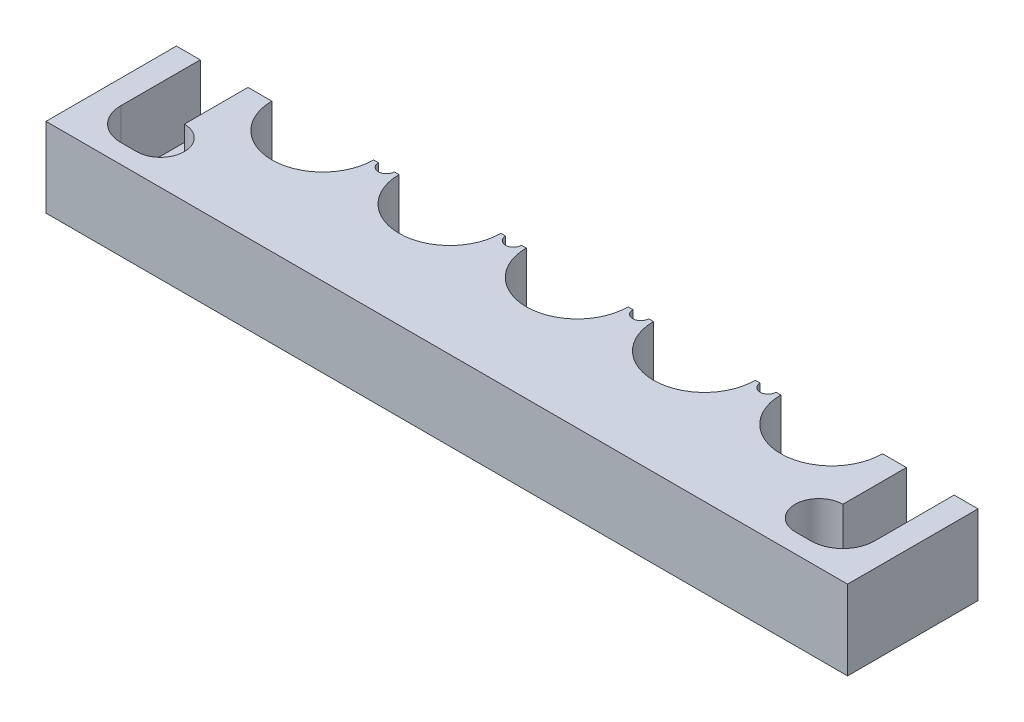
ISO-10303-21;
HEADER;
FILE_DESCRIPTION(('STEP AP214'),'2;1');
FILE_NAME('part.step','',(''),(''),'','','');
FILE_SCHEMA(('AUTOMOTIVE_DESIGN { 1 0 10303 214 1 1 1 1 }'));
ENDSEC;
DATA;
#1=APPLICATION_CONTEXT('core data for automotive mechanical design processes');
#2=APPLICATION_PROTOCOL_DEFINITION('international standard','automotive_design',2000,#1);
#3=PRODUCT_CONTEXT('',#1,'mechanical');
#4=PRODUCT('Part','Part','',(#3));
#5=PRODUCT_RELATED_PRODUCT_CATEGORY('part','',(#4));
#6=PRODUCT_DEFINITION_FORMATION('','',#4);
#7=PRODUCT_DEFINITION_CONTEXT('part definition',#1,'design');
#8=PRODUCT_DEFINITION('design','',#6,#7);
#9=PRODUCT_DEFINITION_SHAPE('','',#8);
#10=(LENGTH_UNIT() NAMED_UNIT(*) SI_UNIT(.MILLI.,.METRE.));
#11=(NAMED_UNIT(*) PLANE_ANGLE_UNIT() SI_UNIT($,.RADIAN.));
#12=(NAMED_UNIT(*) SI_UNIT($,.STERADIAN.) SOLID_ANGLE_UNIT());
#13=UNCERTAINTY_MEASURE_WITH_UNIT(LENGTH_MEASURE(1.E-05),#10,'distance_accuracy_value','');
#14=(GEOMETRIC_REPRESENTATION_CONTEXT(3) GLOBAL_UNCERTAINTY_ASSIGNED_CONTEXT((#13)) GLOBAL_UNIT_ASSIGNED_CONTEXT((#10,
#11,#12)) REPRESENTATION_CONTEXT('',''));
#15=CARTESIAN_POINT('',(0.,0.,0.));
#16=DIRECTION('',(0.,0.,1.));
#17=DIRECTION('',(1.,0.,0.));
#18=AXIS2_PLACEMENT_3D('',#15,#16,#17);
#19=CARTESIAN_POINT('',(-12.8,2.5,0.));
#20=DIRECTION('',(0.,0.,1.));
#21=DIRECTION('',(1.,0.,0.));
#22=AXIS2_PLACEMENT_3D('',#19,#20,#21);
#23=PLANE('',#22);
#24=DIRECTION('',(-1.,0.,0.));
#25=VECTOR('',#24,1.);
#26=CARTESIAN_POINT('',(-12.8,-2.5,0.));
#27=LINE('',#26,#25);
#28=CARTESIAN_POINT('',(-11.2,-2.5,0.));
#29=VERTEX_POINT('',#28);
#30=CARTESIAN_POINT('',(-11.5,-2.5,0.));
#31=VERTEX_POINT('',#30);
#32=EDGE_CURVE('E444',#29,#31,#27,.T.);
#33=ORIENTED_EDGE('',*,*,#32,.T.);
#34=DIRECTION('',(0.,1.,0.));
#35=VECTOR('',#34,1.);
#36=CARTESIAN_POINT('',(-11.5,-2.5,0.));
#37=LINE('',#36,#35);
#38=CARTESIAN_POINT('',(-11.5,2.5,0.));
#39=VERTEX_POINT('',#38);
#40=EDGE_CURVE('E392',#31,#39,#37,.T.);
#41=ORIENTED_EDGE('',*,*,#40,.T.);
#42=DIRECTION('',(-1.,0.,0.));
#43=VECTOR('',#42,1.);
#44=CARTESIAN_POINT('',(-12.8,2.5,0.));
#45=LINE('',#44,#43);
#46=CARTESIAN_POINT('',(-11.2,2.5,0.));
#47=VERTEX_POINT('',#46);
#48=EDGE_CURVE('E405',#47,#39,#45,.T.);
#49=ORIENTED_EDGE('',*,*,#48,.F.);
#50=DIRECTION('',(0.,-1.,0.));
#51=VECTOR('',#50,1.);
#52=CARTESIAN_POINT('',(-11.2,2.5,0.));
#53=LINE('',#52,#51);
#54=EDGE_CURVE('E43',#47,#29,#53,.T.);
#55=ORIENTED_EDGE('',*,*,#54,.T.);
#56=EDGE_LOOP('',(#33,#41,#49,#55));
#57=FACE_BOUND('',#56,.T.);
#58=ADVANCED_FACE('F39',(#57),#23,.F.);
#59=CARTESIAN_POINT('',(11.2,2.5,0.));
#60=DIRECTION('',(0.,0.,1.));
#61=DIRECTION('',(1.,0.,0.));
#62=AXIS2_PLACEMENT_3D('',#59,#60,#61);
#63=PLANE('',#62);
#64=DIRECTION('',(-1.,0.,0.));
#65=VECTOR('',#64,1.);
#66=CARTESIAN_POINT('',(11.2,-2.5,0.));
#67=LINE('',#66,#65);
#68=CARTESIAN_POINT('',(12.8,-2.5,0.));
#69=VERTEX_POINT('',#68);
#70=CARTESIAN_POINT('',(12.5,-2.5,0.));
#71=VERTEX_POINT('',#70);
#72=EDGE_CURVE('E461',#69,#71,#67,.T.);
#73=ORIENTED_EDGE('',*,*,#72,.T.);
#74=DIRECTION('',(0.,1.,0.));
#75=VECTOR('',#74,1.);
#76=CARTESIAN_POINT('',(12.5,-2.5,0.));
#77=LINE('',#76,#75);
#78=CARTESIAN_POINT('',(12.5,2.5,0.));
#79=VERTEX_POINT('',#78);
#80=EDGE_CURVE('E374',#71,#79,#77,.T.);
#81=ORIENTED_EDGE('',*,*,#80,.T.);
#82=DIRECTION('',(-1.,0.,0.));
#83=VECTOR('',#82,1.);
#84=CARTESIAN_POINT('',(11.2,2.5,0.));
#85=LINE('',#84,#83);
#86=CARTESIAN_POINT('',(12.8,2.5,0.));
#87=VERTEX_POINT('',#86);
#88=EDGE_CURVE('E424',#87,#79,#85,.T.);
#89=ORIENTED_EDGE('',*,*,#88,.F.);
#90=DIRECTION('',(0.,-1.,0.));
#91=VECTOR('',#90,1.);
#92=CARTESIAN_POINT('',(12.8,2.5,0.));
#93=LINE('',#92,#91);
#94=EDGE_CURVE('E487',#87,#69,#93,.T.);
#95=ORIENTED_EDGE('',*,*,#94,.T.);
#96=EDGE_LOOP('',(#73,#81,#89,#95));
#97=FACE_BOUND('',#96,.T.);
#98=ADVANCED_FACE('F576',(#97),#63,.F.);
#99=CARTESIAN_POINT('',(3.2,2.5,0.));
#100=DIRECTION('',(0.,0.,1.));
#101=DIRECTION('',(1.,0.,0.));
#102=AXIS2_PLACEMENT_3D('',#99,#100,#101);
#103=PLANE('',#102);
#104=DIRECTION('',(-1.,0.,0.));
#105=VECTOR('',#104,1.);
#106=CARTESIAN_POINT('',(3.2,-2.5,0.));
#107=LINE('',#106,#105);
#108=CARTESIAN_POINT('',(4.8,-2.5,0.));
#109=VERTEX_POINT('',#108);
#110=CARTESIAN_POINT('',(4.5,-2.5,0.));
#111=VERTEX_POINT('',#110);
#112=EDGE_CURVE('E469',#109,#111,#107,.T.);
#113=ORIENTED_EDGE('',*,*,#112,.T.);
#114=DIRECTION('',(0.,1.,0.));
#115=VECTOR('',#114,1.);
#116=CARTESIAN_POINT('',(4.5,-2.5,0.));
#117=LINE('',#116,#115);
#118=CARTESIAN_POINT('',(4.5,2.5,0.));
#119=VERTEX_POINT('',#118);
#120=EDGE_CURVE('E381',#111,#119,#117,.T.);
#121=ORIENTED_EDGE('',*,*,#120,.T.);
#122=DIRECTION('',(-1.,0.,0.));
#123=VECTOR('',#122,1.);
#124=CARTESIAN_POINT('',(3.2,2.5,0.));
#125=LINE('',#124,#123);
#126=CARTESIAN_POINT('',(4.8,2.5,0.));
#127=VERTEX_POINT('',#126);
#128=EDGE_CURVE('E429',#127,#119,#125,.T.);
#129=ORIENTED_EDGE('',*,*,#128,.F.);
#130=DIRECTION('',(0.,-1.,0.));
#131=VECTOR('',#130,1.);
#132=CARTESIAN_POINT('',(4.8,2.5,0.));
#133=LINE('',#132,#131);
#134=EDGE_CURVE('E483',#127,#109,#133,.T.);
#135=ORIENTED_EDGE('',*,*,#134,.T.);
#136=EDGE_LOOP('',(#113,#121,#129,#135));
#137=FACE_BOUND('',#136,.T.);
#138=ADVANCED_FACE('F565',(#137),#103,.F.);
#139=CARTESIAN_POINT('',(-4.8,2.5,0.));
#140=DIRECTION('',(0.,0.,1.));
#141=DIRECTION('',(1.,0.,0.));
#142=AXIS2_PLACEMENT_3D('',#139,#140,#141);
#143=PLANE('',#142);
#144=DIRECTION('',(-1.,0.,0.));
#145=VECTOR('',#144,1.);
#146=CARTESIAN_POINT('',(-4.8,-2.5,0.));
#147=LINE('',#146,#145);
#148=CARTESIAN_POINT('',(-3.2,-2.5,0.));
#149=VERTEX_POINT('',#148);
#150=CARTESIAN_POINT('',(-3.5,-2.5,0.));
#151=VERTEX_POINT('',#150);
#152=EDGE_CURVE('E402',#149,#151,#147,.T.);
#153=ORIENTED_EDGE('',*,*,#152,.T.);
#154=DIRECTION('',(0.,1.,0.));
#155=VECTOR('',#154,1.);
#156=CARTESIAN_POINT('',(-3.5,-2.5,0.));
#157=LINE('',#156,#155);
#158=CARTESIAN_POINT('',(-3.5,2.5,0.));
#159=VERTEX_POINT('',#158);
#160=EDGE_CURVE('E390',#151,#159,#157,.T.);
#161=ORIENTED_EDGE('',*,*,#160,.T.);
#162=DIRECTION('',(-1.,0.,0.));
#163=VECTOR('',#162,1.);
#164=CARTESIAN_POINT('',(-4.8,2.5,0.));
#165=LINE('',#164,#163);
#166=CARTESIAN_POINT('',(-3.2,2.5,0.));
#167=VERTEX_POINT('',#166);
#168=EDGE_CURVE('E436',#167,#159,#165,.T.);
#169=ORIENTED_EDGE('',*,*,#168,.F.);
#170=DIRECTION('',(0.,-1.,0.));
#171=VECTOR('',#170,1.);
#172=CARTESIAN_POINT('',(-3.2,2.5,0.));
#173=LINE('',#172,#171);
#174=EDGE_CURVE('E480',#167,#149,#173,.T.);
#175=ORIENTED_EDGE('',*,*,#174,.T.);
#176=EDGE_LOOP('',(#153,#161,#169,#175));
#177=FACE_BOUND('',#176,.T.);
#178=ADVANCED_FACE('F542',(#177),#143,.F.);
#179=CARTESIAN_POINT('',(-8.,2.5,0.));
#180=DIRECTION('',(0.,-1.,0.));
#181=DIRECTION('',(0.,0.,-1.));
#182=AXIS2_PLACEMENT_3D('',#179,#180,#181);
#183=CYLINDRICAL_SURFACE('',#182,3.2);
#184=CARTESIAN_POINT('',(-8.,-2.5,0.));
#185=DIRECTION('',(0.,-1.,0.));
#186=DIRECTION('',(0.,0.,1.));
#187=AXIS2_PLACEMENT_3D('',#184,#185,#186);
#188=CIRCLE('',#187,3.2);
#189=CARTESIAN_POINT('',(-4.8,-2.5,0.));
#190=VERTEX_POINT('',#189);
#191=EDGE_CURVE('E397',#190,#29,#188,.T.);
#192=ORIENTED_EDGE('',*,*,#191,.T.);
#193=ORIENTED_EDGE('',*,*,#54,.F.);
#194=CARTESIAN_POINT('',(-8.,2.5,0.));
#195=DIRECTION('',(0.,-1.,0.));
#196=DIRECTION('',(0.,0.,1.));
#197=AXIS2_PLACEMENT_3D('',#194,#195,#196);
#198=CIRCLE('',#197,3.2);
#199=CARTESIAN_POINT('',(-4.8,2.5,0.));
#200=VERTEX_POINT('',#199);
#201=EDGE_CURVE('E399',#200,#47,#198,.T.);
#202=ORIENTED_EDGE('',*,*,#201,.F.);
#203=DIRECTION('',(0.,-1.,0.));
#204=VECTOR('',#203,1.);
#205=CARTESIAN_POINT('',(-4.8,2.5,0.));
#206=LINE('',#205,#204);
#207=EDGE_CURVE('E438',#200,#190,#206,.T.);
#208=ORIENTED_EDGE('',*,*,#207,.T.);
#209=EDGE_LOOP('',(#192,#193,#202,#208));
#210=FACE_BOUND('',#209,.T.);
#211=ADVANCED_FACE('F41',(#210),#183,.F.);
#212=CARTESIAN_POINT('',(-12.5,2.5,0.));
#213=VERTEX_POINT('',#212);
#214=CARTESIAN_POINT('',(-12.8,2.5,0.));
#215=VERTEX_POINT('',#214);
#216=EDGE_CURVE('E398',#213,#215,#45,.T.);
#217=ORIENTED_EDGE('',*,*,#216,.F.);
#218=DIRECTION('',(0.,1.,0.));
#219=VECTOR('',#218,1.);
#220=CARTESIAN_POINT('',(-12.5,-2.5,0.));
#221=LINE('',#220,#219);
#222=CARTESIAN_POINT('',(-12.5,-2.5,0.));
#223=VERTEX_POINT('',#222);
#224=EDGE_CURVE('E388',#213,#223,#221,.F.);
#225=ORIENTED_EDGE('',*,*,#224,.T.);
#226=CARTESIAN_POINT('',(-12.8,-2.5,0.));
#227=VERTEX_POINT('',#226);
#228=EDGE_CURVE('E445',#223,#227,#27,.T.);
#229=ORIENTED_EDGE('',*,*,#228,.T.);
#230=DIRECTION('',(0.,-1.,0.));
#231=VECTOR('',#230,1.);
#232=CARTESIAN_POINT('',(-12.8,2.5,0.));
#233=LINE('',#232,#231);
#234=EDGE_CURVE('E506',#215,#227,#233,.T.);
#235=ORIENTED_EDGE('',*,*,#234,.F.);
#236=EDGE_LOOP('',(#217,#225,#229,#235));
#237=FACE_BOUND('',#236,.T.);
#238=ADVANCED_FACE('F533',(#237),#23,.F.);
#239=CARTESIAN_POINT('',(-16.,2.5,0.));
#240=DIRECTION('',(0.,-1.,0.));
#241=DIRECTION('',(0.,0.,-1.));
#242=AXIS2_PLACEMENT_3D('',#239,#240,#241);
#243=CYLINDRICAL_SURFACE('',#242,3.2);
#244=CARTESIAN_POINT('',(-16.,-2.5,0.));
#245=DIRECTION('',(0.,-1.,0.));
#246=DIRECTION('',(0.,0.,1.));
#247=AXIS2_PLACEMENT_3D('',#244,#245,#246);
#248=CIRCLE('',#247,3.2);
#249=CARTESIAN_POINT('',(-19.2,-2.5,0.));
#250=VERTEX_POINT('',#249);
#251=EDGE_CURVE('E446',#227,#250,#248,.T.);
#252=ORIENTED_EDGE('',*,*,#251,.T.);
#253=DIRECTION('',(0.,-1.,0.));
#254=VECTOR('',#253,1.);
#255=CARTESIAN_POINT('',(-19.2,2.5,0.));
#256=LINE('',#255,#254);
#257=CARTESIAN_POINT('',(-19.2,2.5,0.));
#258=VERTEX_POINT('',#257);
#259=EDGE_CURVE('E509',#258,#250,#256,.T.);
#260=ORIENTED_EDGE('',*,*,#259,.F.);
#261=CARTESIAN_POINT('',(-16.,2.5,0.));
#262=DIRECTION('',(0.,-1.,0.));
#263=DIRECTION('',(0.,0.,1.));
#264=AXIS2_PLACEMENT_3D('',#261,#262,#263);
#265=CIRCLE('',#264,3.2);
#266=EDGE_CURVE('E403',#215,#258,#265,.T.);
#267=ORIENTED_EDGE('',*,*,#266,.F.);
#268=ORIENTED_EDGE('',*,*,#234,.T.);
#269=EDGE_LOOP('',(#252,#260,#267,#268));
#270=FACE_BOUND('',#269,.T.);
#271=ADVANCED_FACE('F612',(#270),#243,.F.);
#272=CARTESIAN_POINT('',(-25.2,2.5,0.));
#273=DIRECTION('',(0.,0.,1.));
#274=DIRECTION('',(1.,0.,0.));
#275=AXIS2_PLACEMENT_3D('',#272,#273,#274);
#276=PLANE('',#275);
#277=DIRECTION('',(-1.,0.,0.));
#278=VECTOR('',#277,1.);
#279=CARTESIAN_POINT('',(-23.7,-1.5,0.));
#280=LINE('',#279,#278);
#281=CARTESIAN_POINT('',(-20.7,-1.5,0.));
#282=VERTEX_POINT('',#281);
#283=CARTESIAN_POINT('',(-23.7,-1.5,0.));
#284=VERTEX_POINT('',#283);
#285=EDGE_CURVE('E267',#282,#284,#280,.T.);
#286=ORIENTED_EDGE('',*,*,#285,.F.);
#287=DIRECTION('',(0.,1.,0.));
#288=VECTOR('',#287,1.);
#289=CARTESIAN_POINT('',(-20.7,-1.5,0.));
#290=LINE('',#289,#288);
#291=CARTESIAN_POINT('',(-20.7,2.5,0.));
#292=VERTEX_POINT('',#291);
#293=EDGE_CURVE('E307',#282,#292,#290,.T.);
#294=ORIENTED_EDGE('',*,*,#293,.T.);
#295=DIRECTION('',(-1.,0.,0.));
#296=VECTOR('',#295,1.);
#297=CARTESIAN_POINT('',(-25.2,2.5,0.));
#298=LINE('',#297,#296);
#299=EDGE_CURVE('E407',#258,#292,#298,.T.);
#300=ORIENTED_EDGE('',*,*,#299,.F.);
#301=ORIENTED_EDGE('',*,*,#259,.T.);
#302=DIRECTION('',(-1.,0.,0.));
#303=VECTOR('',#302,1.);
#304=CARTESIAN_POINT('',(-25.2,-2.5,0.));
#305=LINE('',#304,#303);
#306=CARTESIAN_POINT('',(-25.2,-2.5,0.));
#307=VERTEX_POINT('',#306);
#308=EDGE_CURVE('E447',#250,#307,#305,.T.);
#309=ORIENTED_EDGE('',*,*,#308,.T.);
#310=DIRECTION('',(0.,-1.,0.));
#311=VECTOR('',#310,1.);
#312=CARTESIAN_POINT('',(-25.2,2.5,0.));
#313=LINE('',#312,#311);
#314=CARTESIAN_POINT('',(-25.2,2.5,0.));
#315=VERTEX_POINT('',#314);
#316=EDGE_CURVE('E503',#315,#307,#313,.T.);
#317=ORIENTED_EDGE('',*,*,#316,.F.);
#318=CARTESIAN_POINT('',(-23.7,2.5,0.));
#319=VERTEX_POINT('',#318);
#320=EDGE_CURVE('E410',#319,#315,#298,.T.);
#321=ORIENTED_EDGE('',*,*,#320,.F.);
#322=DIRECTION('',(0.,1.,0.));
#323=VECTOR('',#322,1.);
#324=CARTESIAN_POINT('',(-23.7,-1.5,0.));
#325=LINE('',#324,#323);
#326=EDGE_CURVE('E301',#284,#319,#325,.T.);
#327=ORIENTED_EDGE('',*,*,#326,.F.);
#328=EDGE_LOOP('',(#286,#294,#300,#301,#309,#317,#321,#327));
#329=FACE_BOUND('',#328,.T.);
#330=ADVANCED_FACE('F611',(#329),#276,.F.);
#331=CARTESIAN_POINT('',(-25.2,2.5,8.2));
#332=DIRECTION('',(1.,0.,0.));
#333=DIRECTION('',(0.,0.,-1.));
#334=AXIS2_PLACEMENT_3D('',#331,#332,#333);
#335=PLANE('',#334);
#336=DIRECTION('',(0.,0.,1.));
#337=VECTOR('',#336,1.);
#338=CARTESIAN_POINT('',(-25.2,-2.5,8.2));
#339=LINE('',#338,#337);
#340=CARTESIAN_POINT('',(-25.2,-2.5,8.2));
#341=VERTEX_POINT('',#340);
#342=EDGE_CURVE('E449',#307,#341,#339,.T.);
#343=ORIENTED_EDGE('',*,*,#342,.T.);
#344=DIRECTION('',(0.,-1.,0.));
#345=VECTOR('',#344,1.);
#346=CARTESIAN_POINT('',(-25.2,2.5,8.2));
#347=LINE('',#346,#345);
#348=CARTESIAN_POINT('',(-25.2,2.5,8.2));
#349=VERTEX_POINT('',#348);
#350=EDGE_CURVE('E501',#349,#341,#347,.T.);
#351=ORIENTED_EDGE('',*,*,#350,.F.);
#352=DIRECTION('',(0.,0.,1.));
#353=VECTOR('',#352,1.);
#354=CARTESIAN_POINT('',(-25.2,2.5,8.2));
#355=LINE('',#354,#353);
#356=EDGE_CURVE('E412',#315,#349,#355,.T.);
#357=ORIENTED_EDGE('',*,*,#356,.F.);
#358=ORIENTED_EDGE('',*,*,#316,.T.);
#359=EDGE_LOOP('',(#343,#351,#357,#358));
#360=FACE_BOUND('',#359,.T.);
#361=ADVANCED_FACE('F610',(#360),#335,.F.);
#362=CARTESIAN_POINT('',(25.2,2.5,8.2));
#363=DIRECTION('',(0.,0.,-1.));
#364=DIRECTION('',(-1.,0.,0.));
#365=AXIS2_PLACEMENT_3D('',#362,#363,#364);
#366=PLANE('',#365);
#367=DIRECTION('',(1.,0.,0.));
#368=VECTOR('',#367,1.);
#369=CARTESIAN_POINT('',(25.2,-2.5,8.2));
#370=LINE('',#369,#368);
#371=CARTESIAN_POINT('',(25.2,-2.5,8.2));
#372=VERTEX_POINT('',#371);
#373=EDGE_CURVE('E454',#341,#372,#370,.T.);
#374=ORIENTED_EDGE('',*,*,#373,.T.);
#375=DIRECTION('',(0.,-1.,0.));
#376=VECTOR('',#375,1.);
#377=CARTESIAN_POINT('',(25.2,2.5,8.2));
#378=LINE('',#377,#376);
#379=CARTESIAN_POINT('',(25.2,2.5,8.2));
#380=VERTEX_POINT('',#379);
#381=EDGE_CURVE('E499',#380,#372,#378,.T.);
#382=ORIENTED_EDGE('',*,*,#381,.F.);
#383=DIRECTION('',(1.,0.,0.));
#384=VECTOR('',#383,1.);
#385=CARTESIAN_POINT('',(25.2,2.5,8.2));
#386=LINE('',#385,#384);
#387=EDGE_CURVE('E415',#349,#380,#386,.T.);
#388=ORIENTED_EDGE('',*,*,#387,.F.);
#389=ORIENTED_EDGE('',*,*,#350,.T.);
#390=EDGE_LOOP('',(#374,#382,#388,#389));
#391=FACE_BOUND('',#390,.T.);
#392=ADVANCED_FACE('F605',(#391),#366,.F.);
#393=CARTESIAN_POINT('',(25.2,2.5,0.));
#394=DIRECTION('',(-1.,0.,0.));
#395=DIRECTION('',(0.,0.,1.));
#396=AXIS2_PLACEMENT_3D('',#393,#394,#395);
#397=PLANE('',#396);
#398=DIRECTION('',(0.,0.,-1.));
#399=VECTOR('',#398,1.);
#400=CARTESIAN_POINT('',(25.2,-2.5,0.));
#401=LINE('',#400,#399);
#402=CARTESIAN_POINT('',(25.2,-2.5,0.));
#403=VERTEX_POINT('',#402);
#404=EDGE_CURVE('E451',#372,#403,#401,.T.);
#405=ORIENTED_EDGE('',*,*,#404,.T.);
#406=DIRECTION('',(0.,-1.,0.));
#407=VECTOR('',#406,1.);
#408=CARTESIAN_POINT('',(25.2,2.5,0.));
#409=LINE('',#408,#407);
#410=CARTESIAN_POINT('',(25.2,2.5,0.));
#411=VERTEX_POINT('',#410);
#412=EDGE_CURVE('E494',#411,#403,#409,.T.);
#413=ORIENTED_EDGE('',*,*,#412,.F.);
#414=DIRECTION('',(0.,0.,-1.));
#415=VECTOR('',#414,1.);
#416=CARTESIAN_POINT('',(25.2,2.5,0.));
#417=LINE('',#416,#415);
#418=EDGE_CURVE('E413',#380,#411,#417,.T.);
#419=ORIENTED_EDGE('',*,*,#418,.F.);
#420=ORIENTED_EDGE('',*,*,#381,.T.);
#421=EDGE_LOOP('',(#405,#413,#419,#420));
#422=FACE_BOUND('',#421,.T.);
#423=ADVANCED_FACE('F596',(#422),#397,.F.);
#424=CARTESIAN_POINT('',(19.2,2.5,0.));
#425=DIRECTION('',(0.,0.,1.));
#426=DIRECTION('',(1.,0.,0.));
#427=AXIS2_PLACEMENT_3D('',#424,#425,#426);
#428=PLANE('',#427);
#429=DIRECTION('',(-1.,0.,0.));
#430=VECTOR('',#429,1.);
#431=CARTESIAN_POINT('',(23.7,-1.5,0.));
#432=LINE('',#431,#430);
#433=CARTESIAN_POINT('',(23.7,-1.5,0.));
#434=VERTEX_POINT('',#433);
#435=CARTESIAN_POINT('',(20.7,-1.5,0.));
#436=VERTEX_POINT('',#435);
#437=EDGE_CURVE('E349',#434,#436,#432,.T.);
#438=ORIENTED_EDGE('',*,*,#437,.F.);
#439=DIRECTION('',(0.,1.,0.));
#440=VECTOR('',#439,1.);
#441=CARTESIAN_POINT('',(23.7,-1.5,0.));
#442=LINE('',#441,#440);
#443=CARTESIAN_POINT('',(23.7,2.5,0.));
#444=VERTEX_POINT('',#443);
#445=EDGE_CURVE('E318',#434,#444,#442,.T.);
#446=ORIENTED_EDGE('',*,*,#445,.T.);
#447=DIRECTION('',(-1.,0.,0.));
#448=VECTOR('',#447,1.);
#449=CARTESIAN_POINT('',(19.2,2.5,0.));
#450=LINE('',#449,#448);
#451=EDGE_CURVE('E416',#411,#444,#450,.T.);
#452=ORIENTED_EDGE('',*,*,#451,.F.);
#453=ORIENTED_EDGE('',*,*,#412,.T.);
#454=DIRECTION('',(-1.,0.,0.));
#455=VECTOR('',#454,1.);
#456=CARTESIAN_POINT('',(19.2,-2.5,0.));
#457=LINE('',#456,#455);
#458=CARTESIAN_POINT('',(19.2,-2.5,0.));
#459=VERTEX_POINT('',#458);
#460=EDGE_CURVE('E457',#403,#459,#457,.T.);
#461=ORIENTED_EDGE('',*,*,#460,.T.);
#462=DIRECTION('',(0.,-1.,0.));
#463=VECTOR('',#462,1.);
#464=CARTESIAN_POINT('',(19.2,2.5,0.));
#465=LINE('',#464,#463);
#466=CARTESIAN_POINT('',(19.2,2.5,0.));
#467=VERTEX_POINT('',#466);
#468=EDGE_CURVE('E495',#467,#459,#465,.T.);
#469=ORIENTED_EDGE('',*,*,#468,.F.);
#470=CARTESIAN_POINT('',(20.7,2.5,0.));
#471=VERTEX_POINT('',#470);
#472=EDGE_CURVE('E417',#471,#467,#450,.T.);
#473=ORIENTED_EDGE('',*,*,#472,.F.);
#474=DIRECTION('',(0.,1.,0.));
#475=VECTOR('',#474,1.);
#476=CARTESIAN_POINT('',(20.7,-1.5,0.));
#477=LINE('',#476,#475);
#478=EDGE_CURVE('E321',#436,#471,#477,.T.);
#479=ORIENTED_EDGE('',*,*,#478,.F.);
#480=EDGE_LOOP('',(#438,#446,#452,#453,#461,#469,#473,#479));
#481=FACE_BOUND('',#480,.T.);
#482=ADVANCED_FACE('F587',(#481),#428,.F.);
#483=CARTESIAN_POINT('',(16.,2.5,0.));
#484=DIRECTION('',(0.,-1.,0.));
#485=DIRECTION('',(0.,0.,-1.));
#486=AXIS2_PLACEMENT_3D('',#483,#484,#485);
#487=CYLINDRICAL_SURFACE('',#486,3.2);
#488=CARTESIAN_POINT('',(16.,-2.5,0.));
#489=DIRECTION('',(0.,-1.,0.));
#490=DIRECTION('',(0.,0.,1.));
#491=AXIS2_PLACEMENT_3D('',#488,#489,#490);
#492=CIRCLE('',#491,3.2);
#493=EDGE_CURVE('E456',#459,#69,#492,.T.);
#494=ORIENTED_EDGE('',*,*,#493,.T.);
#495=ORIENTED_EDGE('',*,*,#94,.F.);
#496=CARTESIAN_POINT('',(16.,2.5,0.));
#497=DIRECTION('',(0.,-1.,0.));
#498=DIRECTION('',(0.,0.,1.));
#499=AXIS2_PLACEMENT_3D('',#496,#497,#498);
#500=CIRCLE('',#499,3.2);
#501=EDGE_CURVE('E423',#467,#87,#500,.T.);
#502=ORIENTED_EDGE('',*,*,#501,.F.);
#503=ORIENTED_EDGE('',*,*,#468,.T.);
#504=EDGE_LOOP('',(#494,#495,#502,#503));
#505=FACE_BOUND('',#504,.T.);
#506=ADVANCED_FACE('F584',(#505),#487,.F.);
#507=CARTESIAN_POINT('',(11.5,2.5,0.));
#508=VERTEX_POINT('',#507);
#509=CARTESIAN_POINT('',(11.2,2.5,0.));
#510=VERTEX_POINT('',#509);
#511=EDGE_CURVE('E421',#508,#510,#85,.T.);
#512=ORIENTED_EDGE('',*,*,#511,.F.);
#513=DIRECTION('',(0.,1.,0.));
#514=VECTOR('',#513,1.);
#515=CARTESIAN_POINT('',(11.5,-2.5,0.));
#516=LINE('',#515,#514);
#517=CARTESIAN_POINT('',(11.5,-2.5,0.));
#518=VERTEX_POINT('',#517);
#519=EDGE_CURVE('E356',#508,#518,#516,.F.);
#520=ORIENTED_EDGE('',*,*,#519,.T.);
#521=CARTESIAN_POINT('',(11.2,-2.5,0.));
#522=VERTEX_POINT('',#521);
#523=EDGE_CURVE('E458',#518,#522,#67,.T.);
#524=ORIENTED_EDGE('',*,*,#523,.T.);
#525=DIRECTION('',(0.,-1.,0.));
#526=VECTOR('',#525,1.);
#527=CARTESIAN_POINT('',(11.2,2.5,0.));
#528=LINE('',#527,#526);
#529=EDGE_CURVE('E486',#510,#522,#528,.T.);
#530=ORIENTED_EDGE('',*,*,#529,.F.);
#531=EDGE_LOOP('',(#512,#520,#524,#530));
#532=FACE_BOUND('',#531,.T.);
#533=ADVANCED_FACE('F571',(#532),#63,.F.);
#534=CARTESIAN_POINT('',(8.,2.5,0.));
#535=DIRECTION('',(0.,-1.,0.));
#536=DIRECTION('',(0.,0.,-1.));
#537=AXIS2_PLACEMENT_3D('',#534,#535,#536);
#538=CYLINDRICAL_SURFACE('',#537,3.2);
#539=CARTESIAN_POINT('',(8.,-2.5,0.));
#540=DIRECTION('',(0.,-1.,0.));
#541=DIRECTION('',(0.,0.,1.));
#542=AXIS2_PLACEMENT_3D('',#539,#540,#541);
#543=CIRCLE('',#542,3.2);
#544=EDGE_CURVE('E463',#522,#109,#543,.T.);
#545=ORIENTED_EDGE('',*,*,#544,.T.);
#546=ORIENTED_EDGE('',*,*,#134,.F.);
#547=CARTESIAN_POINT('',(8.,2.5,0.));
#548=DIRECTION('',(0.,-1.,0.));
#549=DIRECTION('',(0.,0.,1.));
#550=AXIS2_PLACEMENT_3D('',#547,#548,#549);
#551=CIRCLE('',#550,3.2);
#552=EDGE_CURVE('E430',#510,#127,#551,.T.);
#553=ORIENTED_EDGE('',*,*,#552,.F.);
#554=ORIENTED_EDGE('',*,*,#529,.T.);
#555=EDGE_LOOP('',(#545,#546,#553,#554));
#556=FACE_BOUND('',#555,.T.);
#557=ADVANCED_FACE('F570',(#556),#538,.F.);
#558=CARTESIAN_POINT('',(3.5,2.5,0.));
#559=VERTEX_POINT('',#558);
#560=CARTESIAN_POINT('',(3.2,2.5,0.));
#561=VERTEX_POINT('',#560);
#562=EDGE_CURVE('E427',#559,#561,#125,.T.);
#563=ORIENTED_EDGE('',*,*,#562,.F.);
#564=DIRECTION('',(0.,1.,0.));
#565=VECTOR('',#564,1.);
#566=CARTESIAN_POINT('',(3.5,-2.5,0.));
#567=LINE('',#566,#565);
#568=CARTESIAN_POINT('',(3.5,-2.5,0.));
#569=VERTEX_POINT('',#568);
#570=EDGE_CURVE('E378',#559,#569,#567,.F.);
#571=ORIENTED_EDGE('',*,*,#570,.T.);
#572=CARTESIAN_POINT('',(3.2,-2.5,0.));
#573=VERTEX_POINT('',#572);
#574=EDGE_CURVE('E467',#569,#573,#107,.T.);
#575=ORIENTED_EDGE('',*,*,#574,.T.);
#576=DIRECTION('',(0.,-1.,0.));
#577=VECTOR('',#576,1.);
#578=CARTESIAN_POINT('',(3.2,2.5,0.));
#579=LINE('',#578,#577);
#580=EDGE_CURVE('E477',#561,#573,#579,.T.);
#581=ORIENTED_EDGE('',*,*,#580,.F.);
#582=EDGE_LOOP('',(#563,#571,#575,#581));
#583=FACE_BOUND('',#582,.T.);
#584=ADVANCED_FACE('F553',(#583),#103,.F.);
#585=CARTESIAN_POINT('',(0.,2.5,0.));
#586=DIRECTION('',(0.,-1.,0.));
#587=DIRECTION('',(0.,0.,-1.));
#588=AXIS2_PLACEMENT_3D('',#585,#586,#587);
#589=CYLINDRICAL_SURFACE('',#588,3.2);
#590=CARTESIAN_POINT('',(0.,-2.5,0.));
#591=DIRECTION('',(0.,-1.,0.));
#592=DIRECTION('',(0.,0.,1.));
#593=AXIS2_PLACEMENT_3D('',#590,#591,#592);
#594=CIRCLE('',#593,3.2);
#595=EDGE_CURVE('E468',#573,#149,#594,.T.);
#596=ORIENTED_EDGE('',*,*,#595,.T.);
#597=ORIENTED_EDGE('',*,*,#174,.F.);
#598=CARTESIAN_POINT('',(0.,2.5,0.));
#599=DIRECTION('',(0.,-1.,0.));
#600=DIRECTION('',(0.,0.,1.));
#601=AXIS2_PLACEMENT_3D('',#598,#599,#600);
#602=CIRCLE('',#601,3.2);
#603=EDGE_CURVE('E433',#561,#167,#602,.T.);
#604=ORIENTED_EDGE('',*,*,#603,.F.);
#605=ORIENTED_EDGE('',*,*,#580,.T.);
#606=EDGE_LOOP('',(#596,#597,#604,#605));
#607=FACE_BOUND('',#606,.T.);
#608=ADVANCED_FACE('F548',(#607),#589,.F.);
#609=CARTESIAN_POINT('',(-4.5,2.5,0.));
#610=VERTEX_POINT('',#609);
#611=EDGE_CURVE('E434',#610,#200,#165,.T.);
#612=ORIENTED_EDGE('',*,*,#611,.F.);
#613=DIRECTION('',(0.,1.,0.));
#614=VECTOR('',#613,1.);
#615=CARTESIAN_POINT('',(-4.5,-2.5,0.));
#616=LINE('',#615,#614);
#617=CARTESIAN_POINT('',(-4.5,-2.5,0.));
#618=VERTEX_POINT('',#617);
#619=EDGE_CURVE('E383',#610,#618,#616,.F.);
#620=ORIENTED_EDGE('',*,*,#619,.T.);
#621=EDGE_CURVE('E472',#618,#190,#147,.T.);
#622=ORIENTED_EDGE('',*,*,#621,.T.);
#623=ORIENTED_EDGE('',*,*,#207,.F.);
#624=EDGE_LOOP('',(#612,#620,#622,#623));
#625=FACE_BOUND('',#624,.T.);
#626=ADVANCED_FACE('F538',(#625),#143,.F.);
#627=CARTESIAN_POINT('',(-8.,2.5,0.));
#628=DIRECTION('',(0.,1.,0.));
#629=DIRECTION('',(0.,0.,1.));
#630=AXIS2_PLACEMENT_3D('',#627,#628,#629);
#631=PLANE('',#630);
#632=DIRECTION('',(0.,0.,1.));
#633=VECTOR('',#632,1.);
#634=CARTESIAN_POINT('',(-23.7,2.5,0.));
#635=LINE('',#634,#633);
#636=CARTESIAN_POINT('',(-23.7,2.5,4.99999999999999));
#637=VERTEX_POINT('',#636);
#638=EDGE_CURVE('E57',#319,#637,#635,.T.);
#639=ORIENTED_EDGE('',*,*,#638,.F.);
#640=ORIENTED_EDGE('',*,*,#320,.T.);
#641=ORIENTED_EDGE('',*,*,#356,.T.);
#642=ORIENTED_EDGE('',*,*,#387,.T.);
#643=ORIENTED_EDGE('',*,*,#418,.T.);
#644=ORIENTED_EDGE('',*,*,#451,.T.);
#645=DIRECTION('',(0.,0.,-1.));
#646=VECTOR('',#645,1.);
#647=CARTESIAN_POINT('',(23.7,2.5,0.));
#648=LINE('',#647,#646);
#649=CARTESIAN_POINT('',(23.7,2.5,4.99999999999999));
#650=VERTEX_POINT('',#649);
#651=EDGE_CURVE('E340',#650,#444,#648,.T.);
#652=ORIENTED_EDGE('',*,*,#651,.F.);
#653=CARTESIAN_POINT('',(21.7,2.5,5.));
#654=DIRECTION('',(0.,1.,0.));
#655=DIRECTION('',(0.,0.,1.));
#656=AXIS2_PLACEMENT_3D('',#653,#654,#655);
#657=CIRCLE('',#656,2.);
#658=CARTESIAN_POINT('',(21.7,2.5,7.));
#659=VERTEX_POINT('',#658);
#660=EDGE_CURVE('E300',#659,#650,#657,.T.);
#661=ORIENTED_EDGE('',*,*,#660,.F.);
#662=DIRECTION('',(1.,0.,0.));
#663=VECTOR('',#662,1.);
#664=CARTESIAN_POINT('',(21.7,2.5,7.));
#665=LINE('',#664,#663);
#666=CARTESIAN_POINT('',(20.7,2.5,7.));
#667=VERTEX_POINT('',#666);
#668=EDGE_CURVE('E328',#667,#659,#665,.T.);
#669=ORIENTED_EDGE('',*,*,#668,.F.);
#670=CARTESIAN_POINT('',(20.7,2.5,5.5));
#671=DIRECTION('',(0.,1.,0.));
#672=DIRECTION('',(0.,0.,-1.));
#673=AXIS2_PLACEMENT_3D('',#670,#671,#672);
#674=CIRCLE('',#673,1.5);
#675=CARTESIAN_POINT('',(20.7,2.5,4.));
#676=VERTEX_POINT('',#675);
#677=EDGE_CURVE('E335',#676,#667,#674,.T.);
#678=ORIENTED_EDGE('',*,*,#677,.F.);
#679=DIRECTION('',(0.,0.,1.));
#680=VECTOR('',#679,1.);
#681=CARTESIAN_POINT('',(20.7,2.5,0.));
#682=LINE('',#681,#680);
#683=EDGE_CURVE('E63',#471,#676,#682,.T.);
#684=ORIENTED_EDGE('',*,*,#683,.F.);
#685=ORIENTED_EDGE('',*,*,#472,.T.);
#686=ORIENTED_EDGE('',*,*,#501,.T.);
#687=ORIENTED_EDGE('',*,*,#88,.T.);
#688=CARTESIAN_POINT('',(12.,2.5,0.));
#689=DIRECTION('',(0.,1.,0.));
#690=DIRECTION('',(0.,0.,1.));
#691=AXIS2_PLACEMENT_3D('',#688,#689,#690);
#692=CIRCLE('',#691,0.500000000000003);
#693=EDGE_CURVE('E308',#508,#79,#692,.T.);
#694=ORIENTED_EDGE('',*,*,#693,.F.);
#695=ORIENTED_EDGE('',*,*,#511,.T.);
#696=ORIENTED_EDGE('',*,*,#552,.T.);
#697=ORIENTED_EDGE('',*,*,#128,.T.);
#698=CARTESIAN_POINT('',(4.,2.5,0.));
#699=DIRECTION('',(0.,1.,0.));
#700=DIRECTION('',(0.,0.,1.));
#701=AXIS2_PLACEMENT_3D('',#698,#699,#700);
#702=CIRCLE('',#701,0.500000000000001);
#703=EDGE_CURVE('E362',#559,#119,#702,.T.);
#704=ORIENTED_EDGE('',*,*,#703,.F.);
#705=ORIENTED_EDGE('',*,*,#562,.T.);
#706=ORIENTED_EDGE('',*,*,#603,.T.);
#707=ORIENTED_EDGE('',*,*,#168,.T.);
#708=CARTESIAN_POINT('',(-4.,2.5,0.));
#709=DIRECTION('',(0.,1.,0.));
#710=DIRECTION('',(0.,0.,1.));
#711=AXIS2_PLACEMENT_3D('',#708,#709,#710);
#712=CIRCLE('',#711,0.500000000000001);
#713=EDGE_CURVE('E358',#610,#159,#712,.T.);
#714=ORIENTED_EDGE('',*,*,#713,.F.);
#715=ORIENTED_EDGE('',*,*,#611,.T.);
#716=ORIENTED_EDGE('',*,*,#201,.T.);
#717=ORIENTED_EDGE('',*,*,#48,.T.);
#718=CARTESIAN_POINT('',(-12.,2.5,0.));
#719=DIRECTION('',(0.,1.,0.));
#720=DIRECTION('',(0.,0.,1.));
#721=AXIS2_PLACEMENT_3D('',#718,#719,#720);
#722=CIRCLE('',#721,0.500000000000001);
#723=EDGE_CURVE('E359',#213,#39,#722,.T.);
#724=ORIENTED_EDGE('',*,*,#723,.F.);
#725=ORIENTED_EDGE('',*,*,#216,.T.);
#726=ORIENTED_EDGE('',*,*,#266,.T.);
#727=ORIENTED_EDGE('',*,*,#299,.T.);
#728=DIRECTION('',(0.,0.,-1.));
#729=VECTOR('',#728,1.);
#730=CARTESIAN_POINT('',(-20.7,2.5,0.));
#731=LINE('',#730,#729);
#732=CARTESIAN_POINT('',(-20.7,2.5,4.));
#733=VERTEX_POINT('',#732);
#734=EDGE_CURVE('E282',#733,#292,#731,.T.);
#735=ORIENTED_EDGE('',*,*,#734,.F.);
#736=CARTESIAN_POINT('',(-20.7,2.5,5.5));
#737=DIRECTION('',(0.,1.,0.));
#738=DIRECTION('',(0.,0.,1.));
#739=AXIS2_PLACEMENT_3D('',#736,#737,#738);
#740=CIRCLE('',#739,1.5);
#741=CARTESIAN_POINT('',(-20.7,2.5,7.));
#742=VERTEX_POINT('',#741);
#743=EDGE_CURVE('E284',#742,#733,#740,.T.);
#744=ORIENTED_EDGE('',*,*,#743,.F.);
#745=DIRECTION('',(1.,0.,0.));
#746=VECTOR('',#745,1.);
#747=CARTESIAN_POINT('',(-21.7,2.5,7.));
#748=LINE('',#747,#746);
#749=CARTESIAN_POINT('',(-21.7,2.5,7.));
#750=VERTEX_POINT('',#749);
#751=EDGE_CURVE('E298',#750,#742,#748,.T.);
#752=ORIENTED_EDGE('',*,*,#751,.F.);
#753=CARTESIAN_POINT('',(-21.7,2.5,5.));
#754=DIRECTION('',(0.,1.,0.));
#755=DIRECTION('',(0.,0.,1.));
#756=AXIS2_PLACEMENT_3D('',#753,#754,#755);
#757=CIRCLE('',#756,2.);
#758=EDGE_CURVE('E296',#637,#750,#757,.T.);
#759=ORIENTED_EDGE('',*,*,#758,.F.);
#760=EDGE_LOOP('',(#639,#640,#641,#642,#643,#644,#652,#661,#669,#678,#684,#685,#686,#687,#694,
#695,#696,#697,#704,#705,#706,#707,#714,#715,#716,#717,#724,#725,#726,#727,#735,#744,#752,#759));
#761=FACE_BOUND('',#760,.T.);
#762=ADVANCED_FACE('F531',(#761),#631,.T.);
#763=CARTESIAN_POINT('',(-8.,-2.5,0.));
#764=DIRECTION('',(0.,1.,0.));
#765=DIRECTION('',(0.,0.,1.));
#766=AXIS2_PLACEMENT_3D('',#763,#764,#765);
#767=PLANE('',#766);
#768=ORIENTED_EDGE('',*,*,#228,.F.);
#769=CARTESIAN_POINT('',(-12.,-2.5,0.));
#770=DIRECTION('',(0.,1.,0.));
#771=DIRECTION('',(0.,0.,1.));
#772=AXIS2_PLACEMENT_3D('',#769,#770,#771);
#773=CIRCLE('',#772,0.500000000000001);
#774=EDGE_CURVE('E11',#223,#31,#773,.T.);
#775=ORIENTED_EDGE('',*,*,#774,.T.);
#776=ORIENTED_EDGE('',*,*,#32,.F.);
#777=ORIENTED_EDGE('',*,*,#191,.F.);
#778=ORIENTED_EDGE('',*,*,#621,.F.);
#779=CARTESIAN_POINT('',(-4.,-2.5,0.));
#780=DIRECTION('',(0.,1.,0.));
#781=DIRECTION('',(0.,0.,1.));
#782=AXIS2_PLACEMENT_3D('',#779,#780,#781);
#783=CIRCLE('',#782,0.500000000000001);
#784=EDGE_CURVE('E48',#618,#151,#783,.T.);
#785=ORIENTED_EDGE('',*,*,#784,.T.);
#786=ORIENTED_EDGE('',*,*,#152,.F.);
#787=ORIENTED_EDGE('',*,*,#595,.F.);
#788=ORIENTED_EDGE('',*,*,#574,.F.);
#789=CARTESIAN_POINT('',(4.,-2.5,0.));
#790=DIRECTION('',(0.,1.,0.));
#791=DIRECTION('',(0.,0.,1.));
#792=AXIS2_PLACEMENT_3D('',#789,#790,#791);
#793=CIRCLE('',#792,0.500000000000001);
#794=EDGE_CURVE('E364',#569,#111,#793,.T.);
#795=ORIENTED_EDGE('',*,*,#794,.T.);
#796=ORIENTED_EDGE('',*,*,#112,.F.);
#797=ORIENTED_EDGE('',*,*,#544,.F.);
#798=ORIENTED_EDGE('',*,*,#523,.F.);
#799=CARTESIAN_POINT('',(12.,-2.5,0.));
#800=DIRECTION('',(0.,1.,0.));
#801=DIRECTION('',(0.,0.,1.));
#802=AXIS2_PLACEMENT_3D('',#799,#800,#801);
#803=CIRCLE('',#802,0.500000000000003);
#804=EDGE_CURVE('E369',#518,#71,#803,.T.);
#805=ORIENTED_EDGE('',*,*,#804,.T.);
#806=ORIENTED_EDGE('',*,*,#72,.F.);
#807=ORIENTED_EDGE('',*,*,#493,.F.);
#808=ORIENTED_EDGE('',*,*,#460,.F.);
#809=ORIENTED_EDGE('',*,*,#404,.F.);
#810=ORIENTED_EDGE('',*,*,#373,.F.);
#811=ORIENTED_EDGE('',*,*,#342,.F.);
#812=ORIENTED_EDGE('',*,*,#308,.F.);
#813=ORIENTED_EDGE('',*,*,#251,.F.);
#814=EDGE_LOOP('',(#768,#775,#776,#777,#778,#785,#786,#787,#788,#795,#796,#797,#798,#805,#806,
#807,#808,#809,#810,#811,#812,#813));
#815=FACE_BOUND('',#814,.T.);
#816=ADVANCED_FACE('F523',(#815),#767,.F.);
#817=CARTESIAN_POINT('',(-4.,-2.5,0.));
#818=DIRECTION('',(0.,1.,0.));
#819=DIRECTION('',(0.,0.,1.));
#820=AXIS2_PLACEMENT_3D('',#817,#818,#819);
#821=CYLINDRICAL_SURFACE('',#820,0.500000000000001);
#822=ORIENTED_EDGE('',*,*,#784,.F.);
#823=ORIENTED_EDGE('',*,*,#619,.F.);
#824=ORIENTED_EDGE('',*,*,#713,.T.);
#825=ORIENTED_EDGE('',*,*,#160,.F.);
#826=EDGE_LOOP('',(#822,#823,#824,#825));
#827=FACE_BOUND('',#826,.T.);
#828=ADVANCED_FACE('F539',(#827),#821,.F.);
#829=CARTESIAN_POINT('',(4.,-2.5,0.));
#830=DIRECTION('',(0.,1.,0.));
#831=DIRECTION('',(0.,0.,1.));
#832=AXIS2_PLACEMENT_3D('',#829,#830,#831);
#833=CYLINDRICAL_SURFACE('',#832,0.500000000000001);
#834=ORIENTED_EDGE('',*,*,#794,.F.);
#835=ORIENTED_EDGE('',*,*,#570,.F.);
#836=ORIENTED_EDGE('',*,*,#703,.T.);
#837=ORIENTED_EDGE('',*,*,#120,.F.);
#838=EDGE_LOOP('',(#834,#835,#836,#837));
#839=FACE_BOUND('',#838,.T.);
#840=ADVANCED_FACE('F557',(#839),#833,.F.);
#841=CARTESIAN_POINT('',(12.,-2.5,0.));
#842=DIRECTION('',(0.,1.,0.));
#843=DIRECTION('',(0.,0.,1.));
#844=AXIS2_PLACEMENT_3D('',#841,#842,#843);
#845=CYLINDRICAL_SURFACE('',#844,0.500000000000003);
#846=ORIENTED_EDGE('',*,*,#804,.F.);
#847=ORIENTED_EDGE('',*,*,#519,.F.);
#848=ORIENTED_EDGE('',*,*,#693,.T.);
#849=ORIENTED_EDGE('',*,*,#80,.F.);
#850=EDGE_LOOP('',(#846,#847,#848,#849));
#851=FACE_BOUND('',#850,.T.);
#852=ADVANCED_FACE('F573',(#851),#845,.F.);
#853=CARTESIAN_POINT('',(-12.,-2.5,0.));
#854=DIRECTION('',(0.,1.,0.));
#855=DIRECTION('',(0.,0.,1.));
#856=AXIS2_PLACEMENT_3D('',#853,#854,#855);
#857=CYLINDRICAL_SURFACE('',#856,0.500000000000001);
#858=ORIENTED_EDGE('',*,*,#774,.F.);
#859=ORIENTED_EDGE('',*,*,#224,.F.);
#860=ORIENTED_EDGE('',*,*,#723,.T.);
#861=ORIENTED_EDGE('',*,*,#40,.F.);
#862=EDGE_LOOP('',(#858,#859,#860,#861));
#863=FACE_BOUND('',#862,.T.);
#864=ADVANCED_FACE('F527',(#863),#857,.F.);
#865=CARTESIAN_POINT('',(21.7,-1.5,5.));
#866=DIRECTION('',(0.,1.,0.));
#867=DIRECTION('',(0.,0.,1.));
#868=AXIS2_PLACEMENT_3D('',#865,#866,#867);
#869=CYLINDRICAL_SURFACE('',#868,2.);
#870=ORIENTED_EDGE('',*,*,#660,.T.);
#871=DIRECTION('',(0.,1.,0.));
#872=VECTOR('',#871,1.);
#873=CARTESIAN_POINT('',(23.7,-1.5,4.99999999999999));
#874=LINE('',#873,#872);
#875=CARTESIAN_POINT('',(23.7,-1.5,4.99999999999999));
#876=VERTEX_POINT('',#875);
#877=EDGE_CURVE('E312',#876,#650,#874,.T.);
#878=ORIENTED_EDGE('',*,*,#877,.F.);
#879=CARTESIAN_POINT('',(21.7,-1.5,5.));
#880=DIRECTION('',(0.,1.,0.));
#881=DIRECTION('',(0.,0.,1.));
#882=AXIS2_PLACEMENT_3D('',#879,#880,#881);
#883=CIRCLE('',#882,2.);
#884=CARTESIAN_POINT('',(21.7,-1.5,7.));
#885=VERTEX_POINT('',#884);
#886=EDGE_CURVE('E334',#885,#876,#883,.T.);
#887=ORIENTED_EDGE('',*,*,#886,.F.);
#888=DIRECTION('',(0.,1.,0.));
#889=VECTOR('',#888,1.);
#890=CARTESIAN_POINT('',(21.7,-1.5,7.));
#891=LINE('',#890,#889);
#892=EDGE_CURVE('E330',#885,#659,#891,.T.);
#893=ORIENTED_EDGE('',*,*,#892,.T.);
#894=EDGE_LOOP('',(#870,#878,#887,#893));
#895=FACE_BOUND('',#894,.T.);
#896=ADVANCED_FACE('F638',(#895),#869,.F.);
#897=CARTESIAN_POINT('',(21.7,-1.5,7.));
#898=DIRECTION('',(0.,0.,1.));
#899=DIRECTION('',(1.,0.,0.));
#900=AXIS2_PLACEMENT_3D('',#897,#898,#899);
#901=PLANE('',#900);
#902=ORIENTED_EDGE('',*,*,#668,.T.);
#903=ORIENTED_EDGE('',*,*,#892,.F.);
#904=DIRECTION('',(1.,0.,0.));
#905=VECTOR('',#904,1.);
#906=CARTESIAN_POINT('',(21.7,-1.5,7.));
#907=LINE('',#906,#905);
#908=CARTESIAN_POINT('',(20.7,-1.5,7.));
#909=VERTEX_POINT('',#908);
#910=EDGE_CURVE('E320',#909,#885,#907,.T.);
#911=ORIENTED_EDGE('',*,*,#910,.F.);
#912=DIRECTION('',(0.,1.,0.));
#913=VECTOR('',#912,1.);
#914=CARTESIAN_POINT('',(20.7,-1.5,7.));
#915=LINE('',#914,#913);
#916=EDGE_CURVE('E324',#909,#667,#915,.T.);
#917=ORIENTED_EDGE('',*,*,#916,.T.);
#918=EDGE_LOOP('',(#902,#903,#911,#917));
#919=FACE_BOUND('',#918,.T.);
#920=ADVANCED_FACE('F636',(#919),#901,.F.);
#921=CARTESIAN_POINT('',(20.7,-1.5,5.5));
#922=DIRECTION('',(0.,1.,0.));
#923=DIRECTION('',(0.,0.,1.));
#924=AXIS2_PLACEMENT_3D('',#921,#922,#923);
#925=CYLINDRICAL_SURFACE('',#924,1.5);
#926=ORIENTED_EDGE('',*,*,#677,.T.);
#927=ORIENTED_EDGE('',*,*,#916,.F.);
#928=CARTESIAN_POINT('',(20.7,-1.5,5.5));
#929=DIRECTION('',(0.,1.,0.));
#930=DIRECTION('',(0.,0.,-1.));
#931=AXIS2_PLACEMENT_3D('',#928,#929,#930);
#932=CIRCLE('',#931,1.5);
#933=CARTESIAN_POINT('',(20.7,-1.5,4.));
#934=VERTEX_POINT('',#933);
#935=EDGE_CURVE('E345',#934,#909,#932,.T.);
#936=ORIENTED_EDGE('',*,*,#935,.F.);
#937=DIRECTION('',(0.,1.,0.));
#938=VECTOR('',#937,1.);
#939=CARTESIAN_POINT('',(20.7,-1.5,4.));
#940=LINE('',#939,#938);
#941=EDGE_CURVE('E323',#934,#676,#940,.T.);
#942=ORIENTED_EDGE('',*,*,#941,.T.);
#943=EDGE_LOOP('',(#926,#927,#936,#942));
#944=FACE_BOUND('',#943,.T.);
#945=ADVANCED_FACE('F643',(#944),#925,.F.);
#946=CARTESIAN_POINT('',(20.7,-1.5,0.));
#947=DIRECTION('',(-1.,0.,0.));
#948=DIRECTION('',(0.,0.,1.));
#949=AXIS2_PLACEMENT_3D('',#946,#947,#948);
#950=PLANE('',#949);
#951=ORIENTED_EDGE('',*,*,#683,.T.);
#952=ORIENTED_EDGE('',*,*,#941,.F.);
#953=DIRECTION('',(0.,0.,1.));
#954=VECTOR('',#953,1.);
#955=CARTESIAN_POINT('',(20.7,-1.5,0.));
#956=LINE('',#955,#954);
#957=EDGE_CURVE('E347',#436,#934,#956,.T.);
#958=ORIENTED_EDGE('',*,*,#957,.F.);
#959=ORIENTED_EDGE('',*,*,#478,.T.);
#960=EDGE_LOOP('',(#951,#952,#958,#959));
#961=FACE_BOUND('',#960,.T.);
#962=ADVANCED_FACE('F641',(#961),#950,.F.);
#963=CARTESIAN_POINT('',(23.7,-1.5,0.));
#964=DIRECTION('',(1.,0.,0.));
#965=DIRECTION('',(0.,0.,-1.));
#966=AXIS2_PLACEMENT_3D('',#963,#964,#965);
#967=PLANE('',#966);
#968=ORIENTED_EDGE('',*,*,#651,.T.);
#969=ORIENTED_EDGE('',*,*,#445,.F.);
#970=DIRECTION('',(0.,0.,-1.));
#971=VECTOR('',#970,1.);
#972=CARTESIAN_POINT('',(23.7,-1.5,0.));
#973=LINE('',#972,#971);
#974=EDGE_CURVE('E355',#876,#434,#973,.T.);
#975=ORIENTED_EDGE('',*,*,#974,.F.);
#976=ORIENTED_EDGE('',*,*,#877,.T.);
#977=EDGE_LOOP('',(#968,#969,#975,#976));
#978=FACE_BOUND('',#977,.T.);
#979=ADVANCED_FACE('F628',(#978),#967,.F.);
#980=CARTESIAN_POINT('',(21.7,-1.5,5.));
#981=DIRECTION('',(0.,1.,0.));
#982=DIRECTION('',(0.,0.,1.));
#983=AXIS2_PLACEMENT_3D('',#980,#981,#982);
#984=PLANE('',#983);
#985=ORIENTED_EDGE('',*,*,#886,.T.);
#986=ORIENTED_EDGE('',*,*,#974,.T.);
#987=ORIENTED_EDGE('',*,*,#437,.T.);
#988=ORIENTED_EDGE('',*,*,#957,.T.);
#989=ORIENTED_EDGE('',*,*,#935,.T.);
#990=ORIENTED_EDGE('',*,*,#910,.T.);
#991=EDGE_LOOP('',(#985,#986,#987,#988,#989,#990));
#992=FACE_BOUND('',#991,.T.);
#993=ADVANCED_FACE('F634',(#992),#984,.T.);
#994=CARTESIAN_POINT('',(-23.7,-1.5,0.));
#995=DIRECTION('',(-1.,0.,0.));
#996=DIRECTION('',(0.,0.,1.));
#997=AXIS2_PLACEMENT_3D('',#994,#995,#996);
#998=PLANE('',#997);
#999=ORIENTED_EDGE('',*,*,#638,.T.);
#1000=DIRECTION('',(0.,1.,0.));
#1001=VECTOR('',#1000,1.);
#1002=CARTESIAN_POINT('',(-23.7,-1.5,4.99999999999999));
#1003=LINE('',#1002,#1001);
#1004=CARTESIAN_POINT('',(-23.7,-1.5,4.99999999999999));
#1005=VERTEX_POINT('',#1004);
#1006=EDGE_CURVE('E259',#1005,#637,#1003,.T.);
#1007=ORIENTED_EDGE('',*,*,#1006,.F.);
#1008=DIRECTION('',(0.,0.,1.));
#1009=VECTOR('',#1008,1.);
#1010=CARTESIAN_POINT('',(-23.7,-1.5,0.));
#1011=LINE('',#1010,#1009);
#1012=EDGE_CURVE('E263',#284,#1005,#1011,.T.);
#1013=ORIENTED_EDGE('',*,*,#1012,.F.);
#1014=ORIENTED_EDGE('',*,*,#326,.T.);
#1015=EDGE_LOOP('',(#999,#1007,#1013,#1014));
#1016=FACE_BOUND('',#1015,.T.);
#1017=ADVANCED_FACE('F261',(#1016),#998,.F.);
#1018=CARTESIAN_POINT('',(-20.7,-1.5,0.));
#1019=DIRECTION('',(1.,0.,0.));
#1020=DIRECTION('',(0.,0.,-1.));
#1021=AXIS2_PLACEMENT_3D('',#1018,#1019,#1020);
#1022=PLANE('',#1021);
#1023=ORIENTED_EDGE('',*,*,#734,.T.);
#1024=ORIENTED_EDGE('',*,*,#293,.F.);
#1025=DIRECTION('',(0.,0.,-1.));
#1026=VECTOR('',#1025,1.);
#1027=CARTESIAN_POINT('',(-20.7,-1.5,0.));
#1028=LINE('',#1027,#1026);
#1029=CARTESIAN_POINT('',(-20.7,-1.5,4.));
#1030=VERTEX_POINT('',#1029);
#1031=EDGE_CURVE('E295',#1030,#282,#1028,.T.);
#1032=ORIENTED_EDGE('',*,*,#1031,.F.);
#1033=DIRECTION('',(0.,1.,0.));
#1034=VECTOR('',#1033,1.);
#1035=CARTESIAN_POINT('',(-20.7,-1.5,4.));
#1036=LINE('',#1035,#1034);
#1037=EDGE_CURVE('E309',#1030,#733,#1036,.T.);
#1038=ORIENTED_EDGE('',*,*,#1037,.T.);
#1039=EDGE_LOOP('',(#1023,#1024,#1032,#1038));
#1040=FACE_BOUND('',#1039,.T.);
#1041=ADVANCED_FACE('F620',(#1040),#1022,.F.);
#1042=CARTESIAN_POINT('',(-20.7,-1.5,5.5));
#1043=DIRECTION('',(0.,1.,0.));
#1044=DIRECTION('',(0.,0.,1.));
#1045=AXIS2_PLACEMENT_3D('',#1042,#1043,#1044);
#1046=CYLINDRICAL_SURFACE('',#1045,1.5);
#1047=ORIENTED_EDGE('',*,*,#743,.T.);
#1048=ORIENTED_EDGE('',*,*,#1037,.F.);
#1049=CARTESIAN_POINT('',(-20.7,-1.5,5.5));
#1050=DIRECTION('',(0.,1.,0.));
#1051=DIRECTION('',(0.,0.,1.));
#1052=AXIS2_PLACEMENT_3D('',#1049,#1050,#1051);
#1053=CIRCLE('',#1052,1.5);
#1054=CARTESIAN_POINT('',(-20.7,-1.5,7.));
#1055=VERTEX_POINT('',#1054);
#1056=EDGE_CURVE('E286',#1055,#1030,#1053,.T.);
#1057=ORIENTED_EDGE('',*,*,#1056,.F.);
#1058=DIRECTION('',(0.,1.,0.));
#1059=VECTOR('',#1058,1.);
#1060=CARTESIAN_POINT('',(-20.7,-1.5,7.));
#1061=LINE('',#1060,#1059);
#1062=EDGE_CURVE('E315',#1055,#742,#1061,.T.);
#1063=ORIENTED_EDGE('',*,*,#1062,.T.);
#1064=EDGE_LOOP('',(#1047,#1048,#1057,#1063));
#1065=FACE_BOUND('',#1064,.T.);
#1066=ADVANCED_FACE('F625',(#1065),#1046,.F.);
#1067=CARTESIAN_POINT('',(-21.7,-1.5,7.));
#1068=DIRECTION('',(0.,0.,1.));
#1069=DIRECTION('',(1.,0.,0.));
#1070=AXIS2_PLACEMENT_3D('',#1067,#1068,#1069);
#1071=PLANE('',#1070);
#1072=ORIENTED_EDGE('',*,*,#751,.T.);
#1073=ORIENTED_EDGE('',*,*,#1062,.F.);
#1074=DIRECTION('',(1.,0.,0.));
#1075=VECTOR('',#1074,1.);
#1076=CARTESIAN_POINT('',(-21.7,-1.5,7.));
#1077=LINE('',#1076,#1075);
#1078=CARTESIAN_POINT('',(-21.7,-1.5,7.));
#1079=VERTEX_POINT('',#1078);
#1080=EDGE_CURVE('E280',#1079,#1055,#1077,.T.);
#1081=ORIENTED_EDGE('',*,*,#1080,.F.);
#1082=DIRECTION('',(0.,1.,0.));
#1083=VECTOR('',#1082,1.);
#1084=CARTESIAN_POINT('',(-21.7,-1.5,7.));
#1085=LINE('',#1084,#1083);
#1086=EDGE_CURVE('E268',#1079,#750,#1085,.T.);
#1087=ORIENTED_EDGE('',*,*,#1086,.T.);
#1088=EDGE_LOOP('',(#1072,#1073,#1081,#1087));
#1089=FACE_BOUND('',#1088,.T.);
#1090=ADVANCED_FACE('F624',(#1089),#1071,.F.);
#1091=CARTESIAN_POINT('',(-21.7,-1.5,5.));
#1092=DIRECTION('',(0.,1.,0.));
#1093=DIRECTION('',(0.,0.,1.));
#1094=AXIS2_PLACEMENT_3D('',#1091,#1092,#1093);
#1095=CYLINDRICAL_SURFACE('',#1094,2.);
#1096=ORIENTED_EDGE('',*,*,#758,.T.);
#1097=ORIENTED_EDGE('',*,*,#1086,.F.);
#1098=CARTESIAN_POINT('',(-21.7,-1.5,5.));
#1099=DIRECTION('',(0.,1.,0.));
#1100=DIRECTION('',(0.,0.,1.));
#1101=AXIS2_PLACEMENT_3D('',#1098,#1099,#1100);
#1102=CIRCLE('',#1101,2.);
#1103=EDGE_CURVE('E275',#1005,#1079,#1102,.T.);
#1104=ORIENTED_EDGE('',*,*,#1103,.F.);
#1105=ORIENTED_EDGE('',*,*,#1006,.T.);
#1106=EDGE_LOOP('',(#1096,#1097,#1104,#1105));
#1107=FACE_BOUND('',#1106,.T.);
#1108=ADVANCED_FACE('F272',(#1107),#1095,.F.);
#1109=CARTESIAN_POINT('',(-21.7,-1.5,5.));
#1110=DIRECTION('',(0.,1.,0.));
#1111=DIRECTION('',(0.,0.,1.));
#1112=AXIS2_PLACEMENT_3D('',#1109,#1110,#1111);
#1113=PLANE('',#1112);
#1114=ORIENTED_EDGE('',*,*,#1012,.T.);
#1115=ORIENTED_EDGE('',*,*,#1103,.T.);
#1116=ORIENTED_EDGE('',*,*,#1080,.T.);
#1117=ORIENTED_EDGE('',*,*,#1056,.T.);
#1118=ORIENTED_EDGE('',*,*,#1031,.T.);
#1119=ORIENTED_EDGE('',*,*,#285,.T.);
#1120=EDGE_LOOP('',(#1114,#1115,#1116,#1117,#1118,#1119));
#1121=FACE_BOUND('',#1120,.T.);
#1122=ADVANCED_FACE('F276',(#1121),#1113,.T.);
#1123=CLOSED_SHELL('',(#58,#98,#138,#178,#211,#238,#271,#330,#361,#392,#423,#482,#506,#533,#557,
#584,#608,#626,#762,#816,#828,#840,#852,#864,#896,#920,#945,#962,#979,#993,#1017,#1041,#1066,
#1090,#1108,#1122));
#1124=MANIFOLD_SOLID_BREP('B2',#1123);
#1125=ADVANCED_BREP_SHAPE_REPRESENTATION('',(#18,#1124),#14);
#1126=SHAPE_DEFINITION_REPRESENTATION(#9,#1125);
ENDSEC;
END-ISO-10303-21;
